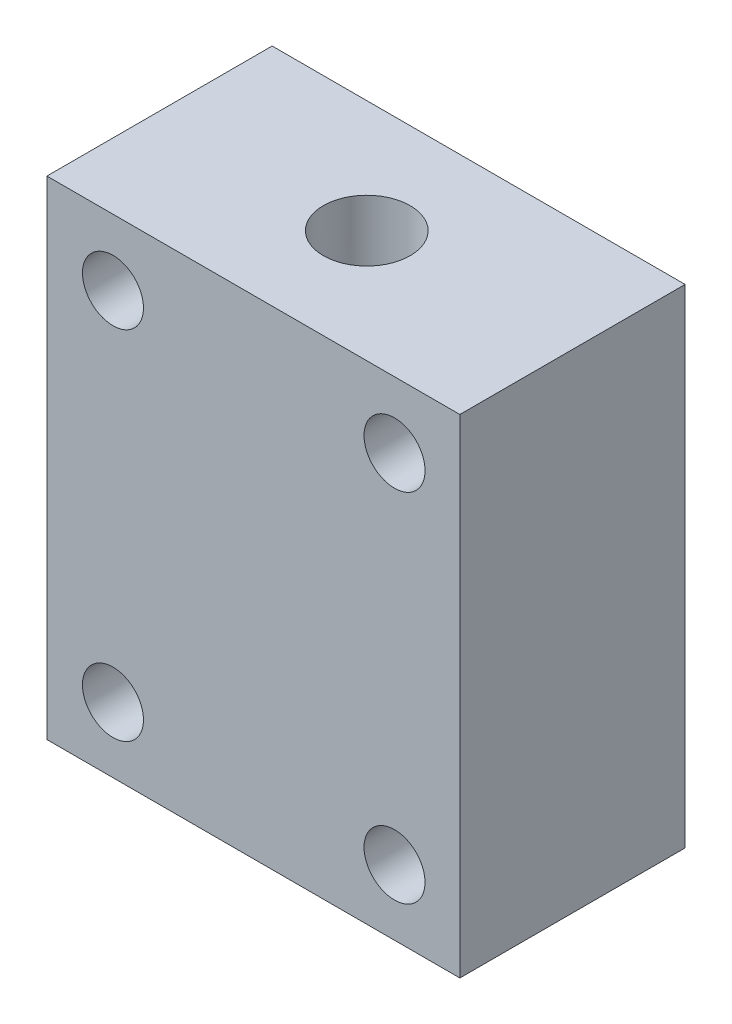
ISO-10303-21;
HEADER;
FILE_DESCRIPTION(('STEP AP214'),'2;1');
FILE_NAME('part.step','',(''),(''),'','','');
FILE_SCHEMA(('AUTOMOTIVE_DESIGN { 1 0 10303 214 1 1 1 1 }'));
ENDSEC;
DATA;
#1=APPLICATION_CONTEXT('core data for automotive mechanical design processes');
#2=APPLICATION_PROTOCOL_DEFINITION('international standard','automotive_design',2000,#1);
#3=PRODUCT_CONTEXT('',#1,'mechanical');
#4=PRODUCT('Part','Part','',(#3));
#5=PRODUCT_RELATED_PRODUCT_CATEGORY('part','',(#4));
#6=PRODUCT_DEFINITION_FORMATION('','',#4);
#7=PRODUCT_DEFINITION_CONTEXT('part definition',#1,'design');
#8=PRODUCT_DEFINITION('design','',#6,#7);
#9=PRODUCT_DEFINITION_SHAPE('','',#8);
#10=(LENGTH_UNIT() NAMED_UNIT(*) SI_UNIT(.MILLI.,.METRE.));
#11=(NAMED_UNIT(*) PLANE_ANGLE_UNIT() SI_UNIT($,.RADIAN.));
#12=(NAMED_UNIT(*) SI_UNIT($,.STERADIAN.) SOLID_ANGLE_UNIT());
#13=UNCERTAINTY_MEASURE_WITH_UNIT(LENGTH_MEASURE(1.E-05),#10,'distance_accuracy_value','');
#14=(GEOMETRIC_REPRESENTATION_CONTEXT(3) GLOBAL_UNCERTAINTY_ASSIGNED_CONTEXT((#13)) GLOBAL_UNIT_ASSIGNED_CONTEXT((#10,
#11,#12)) REPRESENTATION_CONTEXT('',''));
#15=CARTESIAN_POINT('',(0.,0.,0.));
#16=DIRECTION('',(0.,0.,1.));
#17=DIRECTION('',(1.,0.,0.));
#18=AXIS2_PLACEMENT_3D('',#15,#16,#17);
#19=CARTESIAN_POINT('',(34.925,41.275,19.05));
#20=DIRECTION('',(0.,-1.,0.));
#21=DIRECTION('',(0.,0.,-1.));
#22=AXIS2_PLACEMENT_3D('',#19,#20,#21);
#23=PLANE('',#22);
#24=CARTESIAN_POINT('',(0.126999999999997,41.275,0.));
#25=DIRECTION('',(0.,1.,0.));
#26=DIRECTION('',(0.,0.,1.));
#27=AXIS2_PLACEMENT_3D('',#24,#25,#26);
#28=CIRCLE('',#27,7.3421875);
#29=CARTESIAN_POINT('',(0.126999999999997,41.275,7.3421875));
#30=VERTEX_POINT('',#29);
#31=EDGE_CURVE('E227',#30,#30,#28,.T.);
#32=ORIENTED_EDGE('',*,*,#31,.F.);
#33=EDGE_LOOP('',(#32));
#34=FACE_BOUND('',#33,.T.);
#35=DIRECTION('',(-1.,0.,0.));
#36=VECTOR('',#35,1.);
#37=CARTESIAN_POINT('',(34.925,41.275,-19.05));
#38=LINE('',#37,#36);
#39=CARTESIAN_POINT('',(34.925,41.275,-19.05));
#40=VERTEX_POINT('',#39);
#41=CARTESIAN_POINT('',(-34.925,41.275,-19.05));
#42=VERTEX_POINT('',#41);
#43=EDGE_CURVE('E183',#40,#42,#38,.T.);
#44=ORIENTED_EDGE('',*,*,#43,.T.);
#45=DIRECTION('',(0.,0.,-1.));
#46=VECTOR('',#45,1.);
#47=CARTESIAN_POINT('',(-34.925,41.275,19.05));
#48=LINE('',#47,#46);
#49=CARTESIAN_POINT('',(-34.925,41.275,19.05));
#50=VERTEX_POINT('',#49);
#51=EDGE_CURVE('E210',#50,#42,#48,.T.);
#52=ORIENTED_EDGE('',*,*,#51,.F.);
#53=DIRECTION('',(-1.,0.,0.));
#54=VECTOR('',#53,1.);
#55=CARTESIAN_POINT('',(34.925,41.275,19.05));
#56=LINE('',#55,#54);
#57=CARTESIAN_POINT('',(34.925,41.275,19.05));
#58=VERTEX_POINT('',#57);
#59=EDGE_CURVE('E184',#58,#50,#56,.T.);
#60=ORIENTED_EDGE('',*,*,#59,.F.);
#61=DIRECTION('',(0.,0.,-1.));
#62=VECTOR('',#61,1.);
#63=CARTESIAN_POINT('',(34.925,41.275,19.05));
#64=LINE('',#63,#62);
#65=EDGE_CURVE('E194',#58,#40,#64,.T.);
#66=ORIENTED_EDGE('',*,*,#65,.T.);
#67=EDGE_LOOP('',(#44,#52,#60,#66));
#68=FACE_BOUND('',#67,.T.);
#69=ADVANCED_FACE('F43',(#34,#68),#23,.F.);
#70=CARTESIAN_POINT('',(-34.925,-41.275,19.05));
#71=DIRECTION('',(1.,0.,0.));
#72=DIRECTION('',(0.,0.,-1.));
#73=AXIS2_PLACEMENT_3D('',#70,#71,#72);
#74=PLANE('',#73);
#75=DIRECTION('',(0.,-1.,0.));
#76=VECTOR('',#75,1.);
#77=CARTESIAN_POINT('',(-34.925,-41.275,-19.05));
#78=LINE('',#77,#76);
#79=CARTESIAN_POINT('',(-34.925,-41.275,-19.05));
#80=VERTEX_POINT('',#79);
#81=EDGE_CURVE('E197',#42,#80,#78,.T.);
#82=ORIENTED_EDGE('',*,*,#81,.T.);
#83=DIRECTION('',(0.,0.,-1.));
#84=VECTOR('',#83,1.);
#85=CARTESIAN_POINT('',(-34.925,-41.275,19.05));
#86=LINE('',#85,#84);
#87=CARTESIAN_POINT('',(-34.925,-41.275,19.05));
#88=VERTEX_POINT('',#87);
#89=EDGE_CURVE('E207',#88,#80,#86,.T.);
#90=ORIENTED_EDGE('',*,*,#89,.F.);
#91=DIRECTION('',(0.,-1.,0.));
#92=VECTOR('',#91,1.);
#93=CARTESIAN_POINT('',(-34.925,-41.275,19.05));
#94=LINE('',#93,#92);
#95=EDGE_CURVE('E187',#50,#88,#94,.T.);
#96=ORIENTED_EDGE('',*,*,#95,.F.);
#97=ORIENTED_EDGE('',*,*,#51,.T.);
#98=EDGE_LOOP('',(#82,#90,#96,#97));
#99=FACE_BOUND('',#98,.T.);
#100=ADVANCED_FACE('F235',(#99),#74,.F.);
#101=CARTESIAN_POINT('',(34.925,-41.275,19.05));
#102=DIRECTION('',(0.,1.,0.));
#103=DIRECTION('',(0.,0.,1.));
#104=AXIS2_PLACEMENT_3D('',#101,#102,#103);
#105=PLANE('',#104);
#106=DIRECTION('',(1.,0.,0.));
#107=VECTOR('',#106,1.);
#108=CARTESIAN_POINT('',(34.925,-41.275,-19.05));
#109=LINE('',#108,#107);
#110=CARTESIAN_POINT('',(34.925,-41.275,-19.05));
#111=VERTEX_POINT('',#110);
#112=EDGE_CURVE('E199',#80,#111,#109,.T.);
#113=ORIENTED_EDGE('',*,*,#112,.T.);
#114=DIRECTION('',(0.,0.,-1.));
#115=VECTOR('',#114,1.);
#116=CARTESIAN_POINT('',(34.925,-41.275,19.05));
#117=LINE('',#116,#115);
#118=CARTESIAN_POINT('',(34.925,-41.275,19.05));
#119=VERTEX_POINT('',#118);
#120=EDGE_CURVE('E204',#119,#111,#117,.T.);
#121=ORIENTED_EDGE('',*,*,#120,.F.);
#122=DIRECTION('',(1.,0.,0.));
#123=VECTOR('',#122,1.);
#124=CARTESIAN_POINT('',(34.925,-41.275,19.05));
#125=LINE('',#124,#123);
#126=EDGE_CURVE('E190',#88,#119,#125,.T.);
#127=ORIENTED_EDGE('',*,*,#126,.F.);
#128=ORIENTED_EDGE('',*,*,#89,.T.);
#129=EDGE_LOOP('',(#113,#121,#127,#128));
#130=FACE_BOUND('',#129,.T.);
#131=ADVANCED_FACE('F254',(#130),#105,.F.);
#132=CARTESIAN_POINT('',(34.925,-41.275,19.05));
#133=DIRECTION('',(-1.,0.,0.));
#134=DIRECTION('',(0.,0.,1.));
#135=AXIS2_PLACEMENT_3D('',#132,#133,#134);
#136=PLANE('',#135);
#137=DIRECTION('',(0.,1.,0.));
#138=VECTOR('',#137,1.);
#139=CARTESIAN_POINT('',(34.925,-41.275,-19.05));
#140=LINE('',#139,#138);
#141=EDGE_CURVE('E188',#111,#40,#140,.T.);
#142=ORIENTED_EDGE('',*,*,#141,.T.);
#143=ORIENTED_EDGE('',*,*,#65,.F.);
#144=DIRECTION('',(0.,1.,0.));
#145=VECTOR('',#144,1.);
#146=CARTESIAN_POINT('',(34.925,-41.275,19.05));
#147=LINE('',#146,#145);
#148=EDGE_CURVE('E192',#119,#58,#147,.T.);
#149=ORIENTED_EDGE('',*,*,#148,.F.);
#150=ORIENTED_EDGE('',*,*,#120,.T.);
#151=EDGE_LOOP('',(#142,#143,#149,#150));
#152=FACE_BOUND('',#151,.T.);
#153=ADVANCED_FACE('F252',(#152),#136,.F.);
#154=CARTESIAN_POINT('',(0.,0.,19.05));
#155=DIRECTION('',(0.,0.,-1.));
#156=DIRECTION('',(-1.,0.,0.));
#157=AXIS2_PLACEMENT_3D('',#154,#155,#156);
#158=PLANE('',#157);
#159=CARTESIAN_POINT('',(23.876,30.099,19.05));
#160=DIRECTION('',(0.,0.,-1.));
#161=DIRECTION('',(-1.,0.,0.));
#162=AXIS2_PLACEMENT_3D('',#159,#160,#161);
#163=CIRCLE('',#162,5.15937499999998);
#164=CARTESIAN_POINT('',(18.716625,30.099,19.05));
#165=VERTEX_POINT('',#164);
#166=EDGE_CURVE('E162',#165,#165,#163,.T.);
#167=ORIENTED_EDGE('',*,*,#166,.T.);
#168=EDGE_LOOP('',(#167));
#169=FACE_BOUND('',#168,.T.);
#170=CARTESIAN_POINT('',(-23.749,-30.226,19.05));
#171=DIRECTION('',(0.,0.,-1.));
#172=DIRECTION('',(-1.,0.,0.));
#173=AXIS2_PLACEMENT_3D('',#170,#171,#172);
#174=CIRCLE('',#173,5.15937499999998);
#175=CARTESIAN_POINT('',(-28.908375,-30.226,19.05));
#176=VERTEX_POINT('',#175);
#177=EDGE_CURVE('E168',#176,#176,#174,.T.);
#178=ORIENTED_EDGE('',*,*,#177,.T.);
#179=EDGE_LOOP('',(#178));
#180=FACE_BOUND('',#179,.T.);
#181=CARTESIAN_POINT('',(-23.749,30.099,19.05));
#182=DIRECTION('',(0.,0.,-1.));
#183=DIRECTION('',(-1.,0.,0.));
#184=AXIS2_PLACEMENT_3D('',#181,#182,#183);
#185=CIRCLE('',#184,5.15937499999998);
#186=CARTESIAN_POINT('',(-28.908375,30.099,19.05));
#187=VERTEX_POINT('',#186);
#188=EDGE_CURVE('E174',#187,#187,#185,.T.);
#189=ORIENTED_EDGE('',*,*,#188,.T.);
#190=EDGE_LOOP('',(#189));
#191=FACE_BOUND('',#190,.T.);
#192=CARTESIAN_POINT('',(23.876,-30.226,19.05));
#193=DIRECTION('',(0.,0.,-1.));
#194=DIRECTION('',(-1.,0.,0.));
#195=AXIS2_PLACEMENT_3D('',#192,#193,#194);
#196=CIRCLE('',#195,5.15937499999998);
#197=CARTESIAN_POINT('',(18.716625,-30.226,19.05));
#198=VERTEX_POINT('',#197);
#199=EDGE_CURVE('E180',#198,#198,#196,.T.);
#200=ORIENTED_EDGE('',*,*,#199,.T.);
#201=EDGE_LOOP('',(#200));
#202=FACE_BOUND('',#201,.T.);
#203=ORIENTED_EDGE('',*,*,#59,.T.);
#204=ORIENTED_EDGE('',*,*,#95,.T.);
#205=ORIENTED_EDGE('',*,*,#126,.T.);
#206=ORIENTED_EDGE('',*,*,#148,.T.);
#207=EDGE_LOOP('',(#203,#204,#205,#206));
#208=FACE_BOUND('',#207,.T.);
#209=ADVANCED_FACE('F248',(#169,#180,#191,#202,#208),#158,.F.);
#210=CARTESIAN_POINT('',(0.,0.,-19.05));
#211=DIRECTION('',(0.,0.,-1.));
#212=DIRECTION('',(-1.,0.,0.));
#213=AXIS2_PLACEMENT_3D('',#210,#211,#212);
#214=PLANE('',#213);
#215=CARTESIAN_POINT('',(0.126999999999997,17.399,-19.05));
#216=DIRECTION('',(0.,0.,1.));
#217=DIRECTION('',(1.,0.,0.));
#218=AXIS2_PLACEMENT_3D('',#215,#216,#217);
#219=CIRCLE('',#218,12.7254);
#220=CARTESIAN_POINT('',(12.8524,17.399,-19.05));
#221=VERTEX_POINT('',#220);
#222=EDGE_CURVE('E136',#221,#221,#219,.T.);
#223=ORIENTED_EDGE('',*,*,#222,.T.);
#224=EDGE_LOOP('',(#223));
#225=FACE_BOUND('',#224,.T.);
#226=CARTESIAN_POINT('',(0.126999999999997,-17.653,-19.05));
#227=DIRECTION('',(0.,0.,1.));
#228=DIRECTION('',(1.,0.,0.));
#229=AXIS2_PLACEMENT_3D('',#226,#227,#228);
#230=CIRCLE('',#229,12.7254);
#231=CARTESIAN_POINT('',(12.8524,-17.653,-19.05));
#232=VERTEX_POINT('',#231);
#233=EDGE_CURVE('E149',#232,#232,#230,.T.);
#234=ORIENTED_EDGE('',*,*,#233,.T.);
#235=EDGE_LOOP('',(#234));
#236=FACE_BOUND('',#235,.T.);
#237=CARTESIAN_POINT('',(23.876,30.099,-19.05));
#238=DIRECTION('',(0.,0.,-1.));
#239=DIRECTION('',(-1.,0.,0.));
#240=AXIS2_PLACEMENT_3D('',#237,#238,#239);
#241=CIRCLE('',#240,5.15937499999999);
#242=CARTESIAN_POINT('',(18.716625,30.099,-19.05));
#243=VERTEX_POINT('',#242);
#244=EDGE_CURVE('E159',#243,#243,#241,.T.);
#245=ORIENTED_EDGE('',*,*,#244,.F.);
#246=EDGE_LOOP('',(#245));
#247=FACE_BOUND('',#246,.T.);
#248=CARTESIAN_POINT('',(-23.749,-30.226,-19.05));
#249=DIRECTION('',(0.,0.,-1.));
#250=DIRECTION('',(-1.,0.,0.));
#251=AXIS2_PLACEMENT_3D('',#248,#249,#250);
#252=CIRCLE('',#251,5.15937499999999);
#253=CARTESIAN_POINT('',(-28.908375,-30.226,-19.05));
#254=VERTEX_POINT('',#253);
#255=EDGE_CURVE('E165',#254,#254,#252,.T.);
#256=ORIENTED_EDGE('',*,*,#255,.F.);
#257=EDGE_LOOP('',(#256));
#258=FACE_BOUND('',#257,.T.);
#259=CARTESIAN_POINT('',(-23.749,30.099,-19.05));
#260=DIRECTION('',(0.,0.,-1.));
#261=DIRECTION('',(-1.,0.,0.));
#262=AXIS2_PLACEMENT_3D('',#259,#260,#261);
#263=CIRCLE('',#262,5.15937499999999);
#264=CARTESIAN_POINT('',(-28.908375,30.099,-19.05));
#265=VERTEX_POINT('',#264);
#266=EDGE_CURVE('E171',#265,#265,#263,.T.);
#267=ORIENTED_EDGE('',*,*,#266,.F.);
#268=EDGE_LOOP('',(#267));
#269=FACE_BOUND('',#268,.T.);
#270=CARTESIAN_POINT('',(23.876,-30.226,-19.05));
#271=DIRECTION('',(0.,0.,-1.));
#272=DIRECTION('',(-1.,0.,0.));
#273=AXIS2_PLACEMENT_3D('',#270,#271,#272);
#274=CIRCLE('',#273,5.15937499999999);
#275=CARTESIAN_POINT('',(18.716625,-30.226,-19.05));
#276=VERTEX_POINT('',#275);
#277=EDGE_CURVE('E177',#276,#276,#274,.T.);
#278=ORIENTED_EDGE('',*,*,#277,.F.);
#279=EDGE_LOOP('',(#278));
#280=FACE_BOUND('',#279,.T.);
#281=ORIENTED_EDGE('',*,*,#43,.F.);
#282=ORIENTED_EDGE('',*,*,#141,.F.);
#283=ORIENTED_EDGE('',*,*,#112,.F.);
#284=ORIENTED_EDGE('',*,*,#81,.F.);
#285=EDGE_LOOP('',(#281,#282,#283,#284));
#286=FACE_BOUND('',#285,.T.);
#287=ADVANCED_FACE('F242',(#225,#236,#247,#258,#269,#280,#286),#214,.T.);
#288=CARTESIAN_POINT('',(23.876,-30.226,-19.05));
#289=DIRECTION('',(0.,0.,-1.));
#290=DIRECTION('',(-1.,0.,0.));
#291=AXIS2_PLACEMENT_3D('',#288,#289,#290);
#292=CYLINDRICAL_SURFACE('',#291,5.15937499999998);
#293=ORIENTED_EDGE('',*,*,#199,.F.);
#294=EDGE_LOOP('',(#293));
#295=FACE_BOUND('',#294,.T.);
#296=ORIENTED_EDGE('',*,*,#277,.T.);
#297=EDGE_LOOP('',(#296));
#298=FACE_BOUND('',#297,.T.);
#299=ADVANCED_FACE('F265',(#295,#298),#292,.F.);
#300=CARTESIAN_POINT('',(-23.749,30.099,-19.05));
#301=DIRECTION('',(0.,0.,-1.));
#302=DIRECTION('',(-1.,0.,0.));
#303=AXIS2_PLACEMENT_3D('',#300,#301,#302);
#304=CYLINDRICAL_SURFACE('',#303,5.15937499999998);
#305=ORIENTED_EDGE('',*,*,#188,.F.);
#306=EDGE_LOOP('',(#305));
#307=FACE_BOUND('',#306,.T.);
#308=ORIENTED_EDGE('',*,*,#266,.T.);
#309=EDGE_LOOP('',(#308));
#310=FACE_BOUND('',#309,.T.);
#311=ADVANCED_FACE('F271',(#307,#310),#304,.F.);
#312=CARTESIAN_POINT('',(-23.749,-30.226,-19.05));
#313=DIRECTION('',(0.,0.,-1.));
#314=DIRECTION('',(-1.,0.,0.));
#315=AXIS2_PLACEMENT_3D('',#312,#313,#314);
#316=CYLINDRICAL_SURFACE('',#315,5.15937499999998);
#317=ORIENTED_EDGE('',*,*,#177,.F.);
#318=EDGE_LOOP('',(#317));
#319=FACE_BOUND('',#318,.T.);
#320=ORIENTED_EDGE('',*,*,#255,.T.);
#321=EDGE_LOOP('',(#320));
#322=FACE_BOUND('',#321,.T.);
#323=ADVANCED_FACE('F275',(#319,#322),#316,.F.);
#324=CARTESIAN_POINT('',(23.876,30.099,-19.05));
#325=DIRECTION('',(0.,0.,-1.));
#326=DIRECTION('',(-1.,0.,0.));
#327=AXIS2_PLACEMENT_3D('',#324,#325,#326);
#328=CYLINDRICAL_SURFACE('',#327,5.15937499999998);
#329=ORIENTED_EDGE('',*,*,#166,.F.);
#330=EDGE_LOOP('',(#329));
#331=FACE_BOUND('',#330,.T.);
#332=ORIENTED_EDGE('',*,*,#244,.T.);
#333=EDGE_LOOP('',(#332));
#334=FACE_BOUND('',#333,.T.);
#335=ADVANCED_FACE('F279',(#331,#334),#328,.F.);
#336=CARTESIAN_POINT('',(0.126999999999997,-17.653,-16.2306));
#337=DIRECTION('',(0.,0.,-1.));
#338=DIRECTION('',(-1.,0.,0.));
#339=AXIS2_PLACEMENT_3D('',#336,#337,#338);
#340=CYLINDRICAL_SURFACE('',#339,12.7254);
#341=CARTESIAN_POINT('',(0.126999999999997,-17.653,-16.2306));
#342=DIRECTION('',(0.,0.,1.));
#343=DIRECTION('',(1.,0.,0.));
#344=AXIS2_PLACEMENT_3D('',#341,#342,#343);
#345=CIRCLE('',#344,12.7254);
#346=CARTESIAN_POINT('',(12.8524,-17.653,-16.2306));
#347=VERTEX_POINT('',#346);
#348=EDGE_CURVE('E150',#347,#347,#345,.T.);
#349=ORIENTED_EDGE('',*,*,#348,.T.);
#350=EDGE_LOOP('',(#349));
#351=FACE_BOUND('',#350,.T.);
#352=ORIENTED_EDGE('',*,*,#233,.F.);
#353=EDGE_LOOP('',(#352));
#354=FACE_BOUND('',#353,.T.);
#355=ADVANCED_FACE('F283',(#351,#354),#340,.F.);
#356=CARTESIAN_POINT('',(0.126999999999997,-17.653,-16.2306));
#357=DIRECTION('',(0.,0.,1.));
#358=DIRECTION('',(1.,0.,0.));
#359=AXIS2_PLACEMENT_3D('',#356,#357,#358);
#360=PLANE('',#359);
#361=CARTESIAN_POINT('',(0.126999999999997,-17.653,-16.2306));
#362=DIRECTION('',(0.,0.,1.));
#363=DIRECTION('',(1.,0.,0.));
#364=AXIS2_PLACEMENT_3D('',#361,#362,#363);
#365=CIRCLE('',#364,7.3421875);
#366=CARTESIAN_POINT('',(7.4691875,-17.653,-16.2306));
#367=VERTEX_POINT('',#366);
#368=EDGE_CURVE('E153',#367,#367,#365,.T.);
#369=ORIENTED_EDGE('',*,*,#368,.T.);
#370=EDGE_LOOP('',(#369));
#371=FACE_BOUND('',#370,.T.);
#372=ORIENTED_EDGE('',*,*,#348,.F.);
#373=EDGE_LOOP('',(#372));
#374=FACE_BOUND('',#373,.T.);
#375=ADVANCED_FACE('F291',(#371,#374),#360,.F.);
#376=CARTESIAN_POINT('',(0.126999999999997,-17.653,9.398));
#377=DIRECTION('',(0.,0.,1.));
#378=DIRECTION('',(1.,0.,0.));
#379=AXIS2_PLACEMENT_3D('',#376,#377,#378);
#380=PLANE('',#379);
#381=CARTESIAN_POINT('',(0.126999999999997,-17.653,9.398));
#382=DIRECTION('',(0.,0.,1.));
#383=DIRECTION('',(1.,0.,0.));
#384=AXIS2_PLACEMENT_3D('',#381,#382,#383);
#385=CIRCLE('',#384,7.3421875);
#386=CARTESIAN_POINT('',(7.4691875,-17.653,9.398));
#387=VERTEX_POINT('',#386);
#388=EDGE_CURVE('E156',#387,#387,#385,.T.);
#389=ORIENTED_EDGE('',*,*,#388,.F.);
#390=EDGE_LOOP('',(#389));
#391=FACE_BOUND('',#390,.T.);
#392=ADVANCED_FACE('F288',(#391),#380,.F.);
#393=CARTESIAN_POINT('',(0.126999999999997,-17.653,9.398));
#394=DIRECTION('',(0.,0.,-1.));
#395=DIRECTION('',(-1.,0.,0.));
#396=AXIS2_PLACEMENT_3D('',#393,#394,#395);
#397=CYLINDRICAL_SURFACE('',#396,7.3421875);
#398=CARTESIAN_POINT('',(0.126999999999997,-17.653,0.));
#399=DIRECTION('',(0.,-0.707106781186547,-0.707106781186547));
#400=DIRECTION('',(0.,0.707106781186547,-0.707106781186547));
#401=AXIS2_PLACEMENT_3D('',#398,#399,#400);
#402=ELLIPSE('',#401,10.3834211399862,7.3421875);
#403=CARTESIAN_POINT('',(7.30927967188387,-19.177,1.52399999999999));
#404=VERTEX_POINT('',#403);
#405=CARTESIAN_POINT('',(7.4691875,-17.653,0.));
#406=VERTEX_POINT('',#405);
#407=EDGE_CURVE('E57',#404,#406,#402,.F.);
#408=ORIENTED_EDGE('',*,*,#407,.F.);
#409=DIRECTION('',(0.,0.,-1.));
#410=VECTOR('',#409,1.);
#411=CARTESIAN_POINT('',(7.30927967188387,-19.177,9.398));
#412=LINE('',#411,#410);
#413=CARTESIAN_POINT('',(7.30927967188387,-19.177,-1.52399999999999));
#414=VERTEX_POINT('',#413);
#415=EDGE_CURVE('E11',#404,#414,#412,.T.);
#416=ORIENTED_EDGE('',*,*,#415,.T.);
#417=CARTESIAN_POINT('',(0.126999999999997,-17.653,0.));
#418=DIRECTION('',(0.,0.707106781186547,-0.707106781186547));
#419=DIRECTION('',(0.,-0.707106781186547,-0.707106781186547));
#420=AXIS2_PLACEMENT_3D('',#417,#418,#419);
#421=ELLIPSE('',#420,10.3834211399862,7.3421875);
#422=EDGE_CURVE('E113',#406,#414,#421,.T.);
#423=ORIENTED_EDGE('',*,*,#422,.F.);
#424=CARTESIAN_POINT('',(0.126999999999997,-17.653,0.));
#425=DIRECTION('',(0.,-0.707106781186547,-0.707106781186547));
#426=DIRECTION('',(0.,0.707106781186547,-0.707106781186547));
#427=AXIS2_PLACEMENT_3D('',#424,#425,#426);
#428=ELLIPSE('',#427,10.3834211399862,7.3421875);
#429=CARTESIAN_POINT('',(-7.2151875,-17.653,0.));
#430=VERTEX_POINT('',#429);
#431=EDGE_CURVE('E121',#430,#406,#428,.T.);
#432=ORIENTED_EDGE('',*,*,#431,.F.);
#433=CARTESIAN_POINT('',(-7.05527967188387,-19.177,-1.52399999999999));
#434=VERTEX_POINT('',#433);
#435=EDGE_CURVE('E124',#434,#430,#421,.T.);
#436=ORIENTED_EDGE('',*,*,#435,.F.);
#437=DIRECTION('',(0.,0.,-1.));
#438=VECTOR('',#437,1.);
#439=CARTESIAN_POINT('',(-7.05527967188387,-19.177,9.398));
#440=LINE('',#439,#438);
#441=CARTESIAN_POINT('',(-7.05527967188387,-19.177,1.52399999999999));
#442=VERTEX_POINT('',#441);
#443=EDGE_CURVE('E50',#434,#442,#440,.F.);
#444=ORIENTED_EDGE('',*,*,#443,.T.);
#445=EDGE_CURVE('E123',#430,#442,#402,.F.);
#446=ORIENTED_EDGE('',*,*,#445,.F.);
#447=CARTESIAN_POINT('',(0.126999999999997,-17.653,0.));
#448=DIRECTION('',(0.,0.707106781186547,-0.707106781186547));
#449=DIRECTION('',(0.,-0.707106781186547,-0.707106781186547));
#450=AXIS2_PLACEMENT_3D('',#447,#448,#449);
#451=ELLIPSE('',#450,10.3834211399862,7.3421875);
#452=EDGE_CURVE('E120',#406,#430,#451,.F.);
#453=ORIENTED_EDGE('',*,*,#452,.F.);
#454=EDGE_LOOP('',(#408,#416,#423,#432,#436,#444,#446,#453));
#455=FACE_BOUND('',#454,.T.);
#456=ORIENTED_EDGE('',*,*,#368,.F.);
#457=EDGE_LOOP('',(#456));
#458=FACE_BOUND('',#457,.T.);
#459=ORIENTED_EDGE('',*,*,#388,.T.);
#460=EDGE_LOOP('',(#459));
#461=FACE_BOUND('',#460,.T.);
#462=ADVANCED_FACE('F117',(#455,#458,#461),#397,.F.);
#463=CARTESIAN_POINT('',(0.126999999999997,17.399,-16.2306));
#464=DIRECTION('',(0.,0.,-1.));
#465=DIRECTION('',(-1.,0.,0.));
#466=AXIS2_PLACEMENT_3D('',#463,#464,#465);
#467=CYLINDRICAL_SURFACE('',#466,12.7254);
#468=CARTESIAN_POINT('',(0.126999999999997,17.399,-16.2306));
#469=DIRECTION('',(0.,0.,1.));
#470=DIRECTION('',(1.,0.,0.));
#471=AXIS2_PLACEMENT_3D('',#468,#469,#470);
#472=CIRCLE('',#471,12.7254);
#473=CARTESIAN_POINT('',(12.8524,17.399,-16.2306));
#474=VERTEX_POINT('',#473);
#475=EDGE_CURVE('E138',#474,#474,#472,.T.);
#476=ORIENTED_EDGE('',*,*,#475,.T.);
#477=EDGE_LOOP('',(#476));
#478=FACE_BOUND('',#477,.T.);
#479=ORIENTED_EDGE('',*,*,#222,.F.);
#480=EDGE_LOOP('',(#479));
#481=FACE_BOUND('',#480,.T.);
#482=ADVANCED_FACE('F287',(#478,#481),#467,.F.);
#483=CARTESIAN_POINT('',(0.126999999999997,17.399,-16.2306));
#484=DIRECTION('',(0.,0.,1.));
#485=DIRECTION('',(1.,0.,0.));
#486=AXIS2_PLACEMENT_3D('',#483,#484,#485);
#487=PLANE('',#486);
#488=CARTESIAN_POINT('',(0.126999999999997,17.399,-16.2306));
#489=DIRECTION('',(0.,0.,1.));
#490=DIRECTION('',(1.,0.,0.));
#491=AXIS2_PLACEMENT_3D('',#488,#489,#490);
#492=CIRCLE('',#491,7.3421875);
#493=CARTESIAN_POINT('',(7.4691875,17.399,-16.2306));
#494=VERTEX_POINT('',#493);
#495=EDGE_CURVE('E143',#494,#494,#492,.T.);
#496=ORIENTED_EDGE('',*,*,#495,.T.);
#497=EDGE_LOOP('',(#496));
#498=FACE_BOUND('',#497,.T.);
#499=ORIENTED_EDGE('',*,*,#475,.F.);
#500=EDGE_LOOP('',(#499));
#501=FACE_BOUND('',#500,.T.);
#502=ADVANCED_FACE('F303',(#498,#501),#487,.F.);
#503=CARTESIAN_POINT('',(0.126999999999997,17.399,9.398));
#504=DIRECTION('',(0.,0.,-1.));
#505=DIRECTION('',(-1.,0.,0.));
#506=AXIS2_PLACEMENT_3D('',#503,#504,#505);
#507=CYLINDRICAL_SURFACE('',#506,7.3421875);
#508=CARTESIAN_POINT('',(0.126999999999997,17.399,0.));
#509=DIRECTION('',(0.,0.707106781186547,-0.707106781186547));
#510=DIRECTION('',(0.,-0.707106781186547,-0.707106781186547));
#511=AXIS2_PLACEMENT_3D('',#508,#509,#510);
#512=ELLIPSE('',#511,10.3834211399862,7.3421875);
#513=CARTESIAN_POINT('',(7.4691875,17.399,0.));
#514=VERTEX_POINT('',#513);
#515=CARTESIAN_POINT('',(-7.2151875,17.399,0.));
#516=VERTEX_POINT('',#515);
#517=EDGE_CURVE('E220',#514,#516,#512,.T.);
#518=ORIENTED_EDGE('',*,*,#517,.F.);
#519=CARTESIAN_POINT('',(0.126999999999997,17.399,0.));
#520=DIRECTION('',(0.,-0.707106781186547,-0.707106781186547));
#521=DIRECTION('',(0.,0.707106781186547,-0.707106781186547));
#522=AXIS2_PLACEMENT_3D('',#519,#520,#521);
#523=ELLIPSE('',#522,10.3834211399862,7.3421875);
#524=EDGE_CURVE('E218',#516,#514,#523,.T.);
#525=ORIENTED_EDGE('',*,*,#524,.F.);
#526=EDGE_LOOP('',(#518,#525));
#527=FACE_BOUND('',#526,.T.);
#528=ORIENTED_EDGE('',*,*,#495,.F.);
#529=EDGE_LOOP('',(#528));
#530=FACE_BOUND('',#529,.T.);
#531=ADVANCED_FACE('F299',(#527,#530),#507,.F.);
#532=CARTESIAN_POINT('',(0.126999999999997,-19.177,0.));
#533=DIRECTION('',(0.,1.,0.));
#534=DIRECTION('',(0.,0.,1.));
#535=AXIS2_PLACEMENT_3D('',#532,#533,#534);
#536=CYLINDRICAL_SURFACE('',#535,7.3421875);
#537=ORIENTED_EDGE('',*,*,#452,.T.);
#538=ORIENTED_EDGE('',*,*,#431,.T.);
#539=EDGE_LOOP('',(#537,#538));
#540=FACE_BOUND('',#539,.T.);
#541=ORIENTED_EDGE('',*,*,#517,.T.);
#542=CARTESIAN_POINT('',(0.126999999999997,17.399,0.));
#543=DIRECTION('',(0.,-0.707106781186547,-0.707106781186547));
#544=DIRECTION('',(0.,0.707106781186547,-0.707106781186547));
#545=AXIS2_PLACEMENT_3D('',#542,#543,#544);
#546=ELLIPSE('',#545,10.3834211399862,7.3421875);
#547=EDGE_CURVE('E64',#516,#514,#546,.F.);
#548=ORIENTED_EDGE('',*,*,#547,.T.);
#549=EDGE_LOOP('',(#541,#548));
#550=FACE_BOUND('',#549,.T.);
#551=ADVANCED_FACE('F302',(#540,#550),#536,.F.);
#552=CARTESIAN_POINT('',(0.126999999999997,17.399,0.));
#553=DIRECTION('',(0.,0.707106781186547,-0.707106781186547));
#554=DIRECTION('',(0.,-0.707106781186547,-0.707106781186547));
#555=AXIS2_PLACEMENT_3D('',#552,#553,#554);
#556=ELLIPSE('',#555,10.3834211399862,7.3421875);
#557=EDGE_CURVE('E222',#514,#516,#556,.F.);
#558=ORIENTED_EDGE('',*,*,#557,.T.);
#559=ORIENTED_EDGE('',*,*,#524,.T.);
#560=EDGE_LOOP('',(#558,#559));
#561=FACE_BOUND('',#560,.T.);
#562=ORIENTED_EDGE('',*,*,#31,.T.);
#563=EDGE_LOOP('',(#562));
#564=FACE_BOUND('',#563,.T.);
#565=ADVANCED_FACE('F231',(#561,#564),#536,.F.);
#566=CARTESIAN_POINT('',(0.126999999999997,-19.177,0.));
#567=DIRECTION('',(0.,1.,0.));
#568=DIRECTION('',(0.,0.,1.));
#569=AXIS2_PLACEMENT_3D('',#566,#567,#568);
#570=PLANE('',#569);
#571=CARTESIAN_POINT('',(0.126999999999997,-19.177,0.));
#572=DIRECTION('',(0.,1.,0.));
#573=DIRECTION('',(0.,0.,1.));
#574=AXIS2_PLACEMENT_3D('',#571,#572,#573);
#575=CIRCLE('',#574,7.3421875);
#576=EDGE_CURVE('E114',#434,#442,#575,.T.);
#577=ORIENTED_EDGE('',*,*,#576,.T.);
#578=ORIENTED_EDGE('',*,*,#443,.F.);
#579=EDGE_LOOP('',(#577,#578));
#580=FACE_BOUND('',#579,.T.);
#581=ADVANCED_FACE('F225',(#580),#570,.T.);
#582=ORIENTED_EDGE('',*,*,#445,.T.);
#583=ORIENTED_EDGE('',*,*,#576,.F.);
#584=ORIENTED_EDGE('',*,*,#435,.T.);
#585=EDGE_LOOP('',(#582,#583,#584));
#586=FACE_BOUND('',#585,.T.);
#587=ADVANCED_FACE('F226',(#586),#536,.F.);
#588=EDGE_CURVE('E109',#404,#414,#575,.T.);
#589=ORIENTED_EDGE('',*,*,#588,.T.);
#590=ORIENTED_EDGE('',*,*,#415,.F.);
#591=EDGE_LOOP('',(#589,#590));
#592=FACE_BOUND('',#591,.T.);
#593=ADVANCED_FACE('F108',(#592),#570,.T.);
#594=ORIENTED_EDGE('',*,*,#422,.T.);
#595=ORIENTED_EDGE('',*,*,#588,.F.);
#596=ORIENTED_EDGE('',*,*,#407,.T.);
#597=EDGE_LOOP('',(#594,#595,#596));
#598=FACE_BOUND('',#597,.T.);
#599=ADVANCED_FACE('F112',(#598),#536,.F.);
#600=CARTESIAN_POINT('',(0.126999999999997,17.399,9.398));
#601=DIRECTION('',(0.,0.,1.));
#602=DIRECTION('',(1.,0.,0.));
#603=AXIS2_PLACEMENT_3D('',#600,#601,#602);
#604=PLANE('',#603);
#605=CARTESIAN_POINT('',(0.126999999999997,17.399,9.398));
#606=DIRECTION('',(0.,0.,1.));
#607=DIRECTION('',(1.,0.,0.));
#608=AXIS2_PLACEMENT_3D('',#605,#606,#607);
#609=CIRCLE('',#608,7.3421875);
#610=CARTESIAN_POINT('',(7.4691875,17.399,9.398));
#611=VERTEX_POINT('',#610);
#612=EDGE_CURVE('E146',#611,#611,#609,.T.);
#613=ORIENTED_EDGE('',*,*,#612,.F.);
#614=EDGE_LOOP('',(#613));
#615=FACE_BOUND('',#614,.T.);
#616=ADVANCED_FACE('F306',(#615),#604,.F.);
#617=ORIENTED_EDGE('',*,*,#557,.F.);
#618=ORIENTED_EDGE('',*,*,#547,.F.);
#619=EDGE_LOOP('',(#617,#618));
#620=FACE_BOUND('',#619,.T.);
#621=ORIENTED_EDGE('',*,*,#612,.T.);
#622=EDGE_LOOP('',(#621));
#623=FACE_BOUND('',#622,.T.);
#624=ADVANCED_FACE('F305',(#620,#623),#507,.F.);
#625=CLOSED_SHELL('',(#69,#100,#131,#153,#209,#287,#299,#311,#323,#335,#355,#375,#392,#462,#482,
#502,#531,#551,#565,#581,#587,#593,#599,#616,#624));
#626=MANIFOLD_SOLID_BREP('B2',#625);
#627=ADVANCED_BREP_SHAPE_REPRESENTATION('',(#18,#626),#14);
#628=SHAPE_DEFINITION_REPRESENTATION(#9,#627);
ENDSEC;
END-ISO-10303-21;
